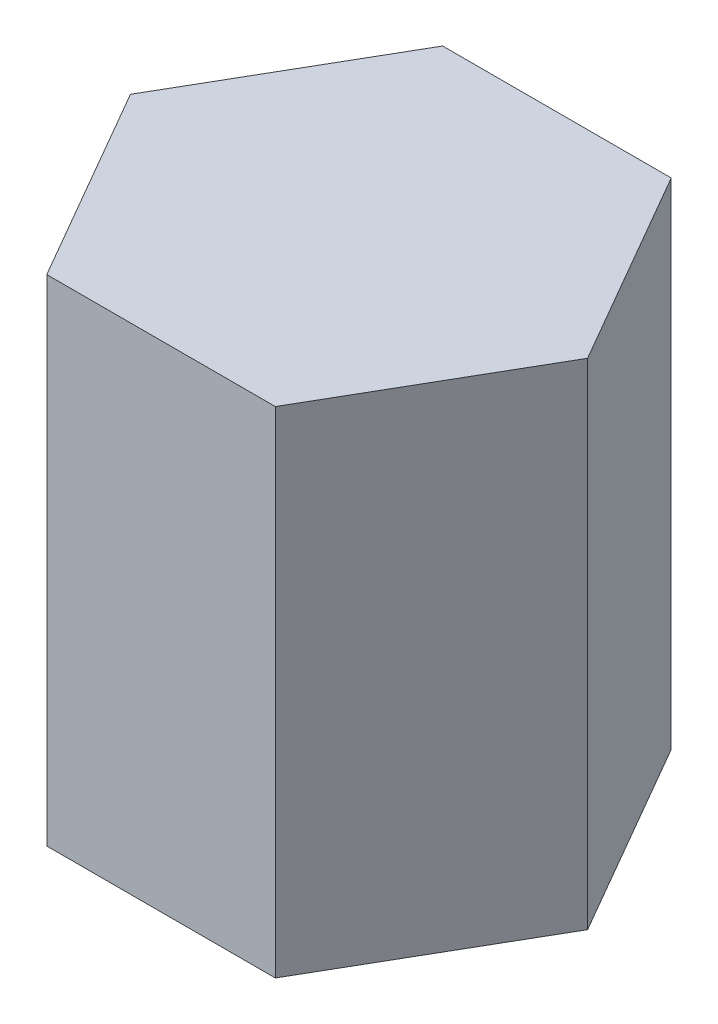
ISO-10303-21;
HEADER;
FILE_DESCRIPTION(('STEP AP214'),'2;1');
FILE_NAME('part.step','',(''),(''),'','','');
FILE_SCHEMA(('AUTOMOTIVE_DESIGN { 1 0 10303 214 1 1 1 1 }'));
ENDSEC;
DATA;
#1=APPLICATION_CONTEXT('core data for automotive mechanical design processes');
#2=APPLICATION_PROTOCOL_DEFINITION('international standard','automotive_design',2000,#1);
#3=PRODUCT_CONTEXT('',#1,'mechanical');
#4=PRODUCT('Part','Part','',(#3));
#5=PRODUCT_RELATED_PRODUCT_CATEGORY('part','',(#4));
#6=PRODUCT_DEFINITION_FORMATION('','',#4);
#7=PRODUCT_DEFINITION_CONTEXT('part definition',#1,'design');
#8=PRODUCT_DEFINITION('design','',#6,#7);
#9=PRODUCT_DEFINITION_SHAPE('','',#8);
#10=(LENGTH_UNIT() NAMED_UNIT(*) SI_UNIT(.MILLI.,.METRE.));
#11=(NAMED_UNIT(*) PLANE_ANGLE_UNIT() SI_UNIT($,.RADIAN.));
#12=(NAMED_UNIT(*) SI_UNIT($,.STERADIAN.) SOLID_ANGLE_UNIT());
#13=UNCERTAINTY_MEASURE_WITH_UNIT(LENGTH_MEASURE(1.E-05),#10,'distance_accuracy_value','');
#14=(GEOMETRIC_REPRESENTATION_CONTEXT(3) GLOBAL_UNCERTAINTY_ASSIGNED_CONTEXT((#13)) GLOBAL_UNIT_ASSIGNED_CONTEXT((#10,
#11,#12)) REPRESENTATION_CONTEXT('',''));
#15=CARTESIAN_POINT('',(0.,0.,0.));
#16=DIRECTION('',(0.,0.,1.));
#17=DIRECTION('',(1.,0.,0.));
#18=AXIS2_PLACEMENT_3D('',#15,#16,#17);
#19=CARTESIAN_POINT('',(0.,50.,0.));
#20=DIRECTION('',(0.,-1.,0.));
#21=DIRECTION('',(0.,0.,-1.));
#22=AXIS2_PLACEMENT_3D('',#19,#20,#21);
#23=CYLINDRICAL_SURFACE('',#22,9.67);
#24=CARTESIAN_POINT('',(0.,0.,0.));
#25=DIRECTION('',(0.,1.,0.));
#26=DIRECTION('',(0.,0.,1.));
#27=AXIS2_PLACEMENT_3D('',#24,#25,#26);
#28=CIRCLE('',#27,9.67);
#29=CARTESIAN_POINT('',(0.,0.,9.67));
#30=VERTEX_POINT('',#29);
#31=EDGE_CURVE('E138',#30,#30,#28,.T.);
#32=ORIENTED_EDGE('',*,*,#31,.F.);
#33=EDGE_LOOP('',(#32));
#34=FACE_BOUND('',#33,.T.);
#35=CARTESIAN_POINT('',(0.,47.,0.));
#36=DIRECTION('',(0.,1.,0.));
#37=DIRECTION('',(0.,0.,1.));
#38=AXIS2_PLACEMENT_3D('',#35,#36,#37);
#39=CIRCLE('',#38,9.67);
#40=CARTESIAN_POINT('',(0.,47.,9.67));
#41=VERTEX_POINT('',#40);
#42=EDGE_CURVE('E279',#41,#41,#39,.T.);
#43=ORIENTED_EDGE('',*,*,#42,.T.);
#44=EDGE_LOOP('',(#43));
#45=FACE_BOUND('',#44,.T.);
#46=ADVANCED_FACE('F43',(#34,#45),#23,.F.);
#47=CARTESIAN_POINT('',(0.,50.,0.));
#48=DIRECTION('',(0.,1.,0.));
#49=DIRECTION('',(0.,0.,1.));
#50=AXIS2_PLACEMENT_3D('',#47,#48,#49);
#51=PLANE('',#50);
#52=DIRECTION('',(0.5,0.,-0.866025403784439));
#53=VECTOR('',#52,1.);
#54=CARTESIAN_POINT('',(11.5470053837925,50.,20.));
#55=LINE('',#54,#53);
#56=CARTESIAN_POINT('',(11.5470053837925,50.,20.));
#57=VERTEX_POINT('',#56);
#58=CARTESIAN_POINT('',(23.094010767585,50.,0.));
#59=VERTEX_POINT('',#58);
#60=EDGE_CURVE('E150',#57,#59,#55,.T.);
#61=ORIENTED_EDGE('',*,*,#60,.T.);
#62=DIRECTION('',(-0.5,0.,-0.866025403784438));
#63=VECTOR('',#62,1.);
#64=CARTESIAN_POINT('',(23.094010767585,50.,0.));
#65=LINE('',#64,#63);
#66=CARTESIAN_POINT('',(11.5470053837925,50.,-20.));
#67=VERTEX_POINT('',#66);
#68=EDGE_CURVE('E98',#59,#67,#65,.T.);
#69=ORIENTED_EDGE('',*,*,#68,.T.);
#70=DIRECTION('',(-1.,0.,0.));
#71=VECTOR('',#70,1.);
#72=CARTESIAN_POINT('',(11.5470053837925,50.,-20.));
#73=LINE('',#72,#71);
#74=CARTESIAN_POINT('',(-11.5470053837925,50.,-20.));
#75=VERTEX_POINT('',#74);
#76=EDGE_CURVE('E111',#67,#75,#73,.T.);
#77=ORIENTED_EDGE('',*,*,#76,.T.);
#78=DIRECTION('',(-0.5,0.,0.866025403784439));
#79=VECTOR('',#78,1.);
#80=CARTESIAN_POINT('',(-11.5470053837925,50.,-20.));
#81=LINE('',#80,#79);
#82=CARTESIAN_POINT('',(-23.094010767585,50.,0.));
#83=VERTEX_POINT('',#82);
#84=EDGE_CURVE('E105',#75,#83,#81,.T.);
#85=ORIENTED_EDGE('',*,*,#84,.T.);
#86=DIRECTION('',(0.5,0.,0.866025403784439));
#87=VECTOR('',#86,1.);
#88=CARTESIAN_POINT('',(-23.094010767585,50.,0.));
#89=LINE('',#88,#87);
#90=CARTESIAN_POINT('',(-11.5470053837925,50.,20.));
#91=VERTEX_POINT('',#90);
#92=EDGE_CURVE('E109',#83,#91,#89,.T.);
#93=ORIENTED_EDGE('',*,*,#92,.T.);
#94=DIRECTION('',(1.,0.,0.));
#95=VECTOR('',#94,1.);
#96=CARTESIAN_POINT('',(-11.5470053837925,50.,20.));
#97=LINE('',#96,#95);
#98=EDGE_CURVE('E61',#91,#57,#97,.T.);
#99=ORIENTED_EDGE('',*,*,#98,.T.);
#100=EDGE_LOOP('',(#61,#69,#77,#85,#93,#99));
#101=FACE_BOUND('',#100,.T.);
#102=ADVANCED_FACE('F107',(#101),#51,.T.);
#103=CARTESIAN_POINT('',(0.,0.,0.));
#104=DIRECTION('',(0.,1.,0.));
#105=DIRECTION('',(0.,0.,1.));
#106=AXIS2_PLACEMENT_3D('',#103,#104,#105);
#107=PLANE('',#106);
#108=DIRECTION('',(0.5,0.,-0.866025403784439));
#109=VECTOR('',#108,1.);
#110=CARTESIAN_POINT('',(11.5470053837925,0.,20.));
#111=LINE('',#110,#109);
#112=CARTESIAN_POINT('',(11.5470053837925,0.,20.));
#113=VERTEX_POINT('',#112);
#114=CARTESIAN_POINT('',(23.094010767585,0.,0.));
#115=VERTEX_POINT('',#114);
#116=EDGE_CURVE('E133',#113,#115,#111,.T.);
#117=ORIENTED_EDGE('',*,*,#116,.F.);
#118=DIRECTION('',(1.,0.,0.));
#119=VECTOR('',#118,1.);
#120=CARTESIAN_POINT('',(-11.5470053837925,0.,20.));
#121=LINE('',#120,#119);
#122=CARTESIAN_POINT('',(-11.5470053837925,0.,20.));
#123=VERTEX_POINT('',#122);
#124=EDGE_CURVE('E90',#123,#113,#121,.T.);
#125=ORIENTED_EDGE('',*,*,#124,.F.);
#126=DIRECTION('',(0.5,0.,0.866025403784439));
#127=VECTOR('',#126,1.);
#128=CARTESIAN_POINT('',(-23.094010767585,0.,0.));
#129=LINE('',#128,#127);
#130=CARTESIAN_POINT('',(-23.094010767585,0.,0.));
#131=VERTEX_POINT('',#130);
#132=EDGE_CURVE('E84',#131,#123,#129,.T.);
#133=ORIENTED_EDGE('',*,*,#132,.F.);
#134=DIRECTION('',(-0.5,0.,0.866025403784439));
#135=VECTOR('',#134,1.);
#136=CARTESIAN_POINT('',(-11.5470053837925,0.,-20.));
#137=LINE('',#136,#135);
#138=CARTESIAN_POINT('',(-11.5470053837925,0.,-20.));
#139=VERTEX_POINT('',#138);
#140=EDGE_CURVE('E120',#139,#131,#137,.T.);
#141=ORIENTED_EDGE('',*,*,#140,.F.);
#142=DIRECTION('',(-1.,0.,0.));
#143=VECTOR('',#142,1.);
#144=CARTESIAN_POINT('',(11.5470053837925,0.,-20.));
#145=LINE('',#144,#143);
#146=CARTESIAN_POINT('',(11.5470053837925,0.,-20.));
#147=VERTEX_POINT('',#146);
#148=EDGE_CURVE('E141',#147,#139,#145,.T.);
#149=ORIENTED_EDGE('',*,*,#148,.F.);
#150=DIRECTION('',(-0.5,0.,-0.866025403784438));
#151=VECTOR('',#150,1.);
#152=CARTESIAN_POINT('',(23.094010767585,0.,0.));
#153=LINE('',#152,#151);
#154=EDGE_CURVE('E137',#115,#147,#153,.T.);
#155=ORIENTED_EDGE('',*,*,#154,.F.);
#156=EDGE_LOOP('',(#117,#125,#133,#141,#149,#155));
#157=FACE_BOUND('',#156,.T.);
#158=ORIENTED_EDGE('',*,*,#31,.T.);
#159=EDGE_LOOP('',(#158));
#160=FACE_BOUND('',#159,.T.);
#161=ADVANCED_FACE('F163',(#157,#160),#107,.F.);
#162=CARTESIAN_POINT('',(11.5470053837925,50.,20.));
#163=DIRECTION('',(-0.866025403784439,0.,-0.5));
#164=DIRECTION('',(-0.5,0.,0.866025403784439));
#165=AXIS2_PLACEMENT_3D('',#162,#163,#164);
#166=PLANE('',#165);
#167=ORIENTED_EDGE('',*,*,#116,.T.);
#168=DIRECTION('',(0.,-1.,0.));
#169=VECTOR('',#168,1.);
#170=CARTESIAN_POINT('',(23.094010767585,50.,0.));
#171=LINE('',#170,#169);
#172=EDGE_CURVE('E11',#59,#115,#171,.T.);
#173=ORIENTED_EDGE('',*,*,#172,.F.);
#174=ORIENTED_EDGE('',*,*,#60,.F.);
#175=DIRECTION('',(0.,-1.,0.));
#176=VECTOR('',#175,1.);
#177=CARTESIAN_POINT('',(11.5470053837925,50.,20.));
#178=LINE('',#177,#176);
#179=EDGE_CURVE('E129',#57,#113,#178,.T.);
#180=ORIENTED_EDGE('',*,*,#179,.T.);
#181=EDGE_LOOP('',(#167,#173,#174,#180));
#182=FACE_BOUND('',#181,.T.);
#183=ADVANCED_FACE('F45',(#182),#166,.F.);
#184=CARTESIAN_POINT('',(23.094010767585,50.,0.));
#185=DIRECTION('',(-0.866025403784438,0.,0.5));
#186=DIRECTION('',(0.5,0.,0.866025403784439));
#187=AXIS2_PLACEMENT_3D('',#184,#185,#186);
#188=PLANE('',#187);
#189=ORIENTED_EDGE('',*,*,#154,.T.);
#190=DIRECTION('',(0.,-1.,0.));
#191=VECTOR('',#190,1.);
#192=CARTESIAN_POINT('',(11.5470053837925,50.,-20.));
#193=LINE('',#192,#191);
#194=EDGE_CURVE('E53',#67,#147,#193,.T.);
#195=ORIENTED_EDGE('',*,*,#194,.F.);
#196=ORIENTED_EDGE('',*,*,#68,.F.);
#197=ORIENTED_EDGE('',*,*,#172,.T.);
#198=EDGE_LOOP('',(#189,#195,#196,#197));
#199=FACE_BOUND('',#198,.T.);
#200=ADVANCED_FACE('F193',(#199),#188,.F.);
#201=CARTESIAN_POINT('',(11.5470053837925,50.,-20.));
#202=DIRECTION('',(0.,0.,1.));
#203=DIRECTION('',(1.,0.,0.));
#204=AXIS2_PLACEMENT_3D('',#201,#202,#203);
#205=PLANE('',#204);
#206=ORIENTED_EDGE('',*,*,#148,.T.);
#207=DIRECTION('',(0.,-1.,0.));
#208=VECTOR('',#207,1.);
#209=CARTESIAN_POINT('',(-11.5470053837925,50.,-20.));
#210=LINE('',#209,#208);
#211=EDGE_CURVE('E122',#75,#139,#210,.T.);
#212=ORIENTED_EDGE('',*,*,#211,.F.);
#213=ORIENTED_EDGE('',*,*,#76,.F.);
#214=ORIENTED_EDGE('',*,*,#194,.T.);
#215=EDGE_LOOP('',(#206,#212,#213,#214));
#216=FACE_BOUND('',#215,.T.);
#217=ADVANCED_FACE('F160',(#216),#205,.F.);
#218=CARTESIAN_POINT('',(-11.5470053837925,50.,-20.));
#219=DIRECTION('',(0.866025403784439,0.,0.5));
#220=DIRECTION('',(0.5,0.,-0.866025403784439));
#221=AXIS2_PLACEMENT_3D('',#218,#219,#220);
#222=PLANE('',#221);
#223=ORIENTED_EDGE('',*,*,#140,.T.);
#224=DIRECTION('',(0.,-1.,0.));
#225=VECTOR('',#224,1.);
#226=CARTESIAN_POINT('',(-23.094010767585,50.,0.));
#227=LINE('',#226,#225);
#228=EDGE_CURVE('E117',#83,#131,#227,.T.);
#229=ORIENTED_EDGE('',*,*,#228,.F.);
#230=ORIENTED_EDGE('',*,*,#84,.F.);
#231=ORIENTED_EDGE('',*,*,#211,.T.);
#232=EDGE_LOOP('',(#223,#229,#230,#231));
#233=FACE_BOUND('',#232,.T.);
#234=ADVANCED_FACE('F118',(#233),#222,.F.);
#235=CARTESIAN_POINT('',(-23.094010767585,50.,0.));
#236=DIRECTION('',(0.866025403784439,0.,-0.5));
#237=DIRECTION('',(-0.5,0.,-0.866025403784439));
#238=AXIS2_PLACEMENT_3D('',#235,#236,#237);
#239=PLANE('',#238);
#240=ORIENTED_EDGE('',*,*,#132,.T.);
#241=DIRECTION('',(0.,-1.,0.));
#242=VECTOR('',#241,1.);
#243=CARTESIAN_POINT('',(-11.5470053837925,50.,20.));
#244=LINE('',#243,#242);
#245=EDGE_CURVE('E123',#91,#123,#244,.T.);
#246=ORIENTED_EDGE('',*,*,#245,.F.);
#247=ORIENTED_EDGE('',*,*,#92,.F.);
#248=ORIENTED_EDGE('',*,*,#228,.T.);
#249=EDGE_LOOP('',(#240,#246,#247,#248));
#250=FACE_BOUND('',#249,.T.);
#251=ADVANCED_FACE('F125',(#250),#239,.F.);
#252=CARTESIAN_POINT('',(-11.5470053837925,50.,20.));
#253=DIRECTION('',(0.,0.,-1.));
#254=DIRECTION('',(-1.,0.,0.));
#255=AXIS2_PLACEMENT_3D('',#252,#253,#254);
#256=PLANE('',#255);
#257=ORIENTED_EDGE('',*,*,#124,.T.);
#258=ORIENTED_EDGE('',*,*,#179,.F.);
#259=ORIENTED_EDGE('',*,*,#98,.F.);
#260=ORIENTED_EDGE('',*,*,#245,.T.);
#261=EDGE_LOOP('',(#257,#258,#259,#260));
#262=FACE_BOUND('',#261,.T.);
#263=ADVANCED_FACE('F168',(#262),#256,.F.);
#264=CARTESIAN_POINT('',(0.,47.,0.));
#265=DIRECTION('',(0.,1.,0.));
#266=DIRECTION('',(0.,0.,1.));
#267=AXIS2_PLACEMENT_3D('',#264,#265,#266);
#268=PLANE('',#267);
#269=ORIENTED_EDGE('',*,*,#42,.F.);
#270=EDGE_LOOP('',(#269));
#271=FACE_BOUND('',#270,.T.);
#272=ADVANCED_FACE('F170',(#271),#268,.F.);
#273=CLOSED_SHELL('',(#46,#102,#161,#183,#200,#217,#234,#251,#263,#272));
#274=MANIFOLD_SOLID_BREP('B2',#273);
#275=ADVANCED_BREP_SHAPE_REPRESENTATION('',(#18,#274),#14);
#276=SHAPE_DEFINITION_REPRESENTATION(#9,#275);
ENDSEC;
END-ISO-10303-21;
